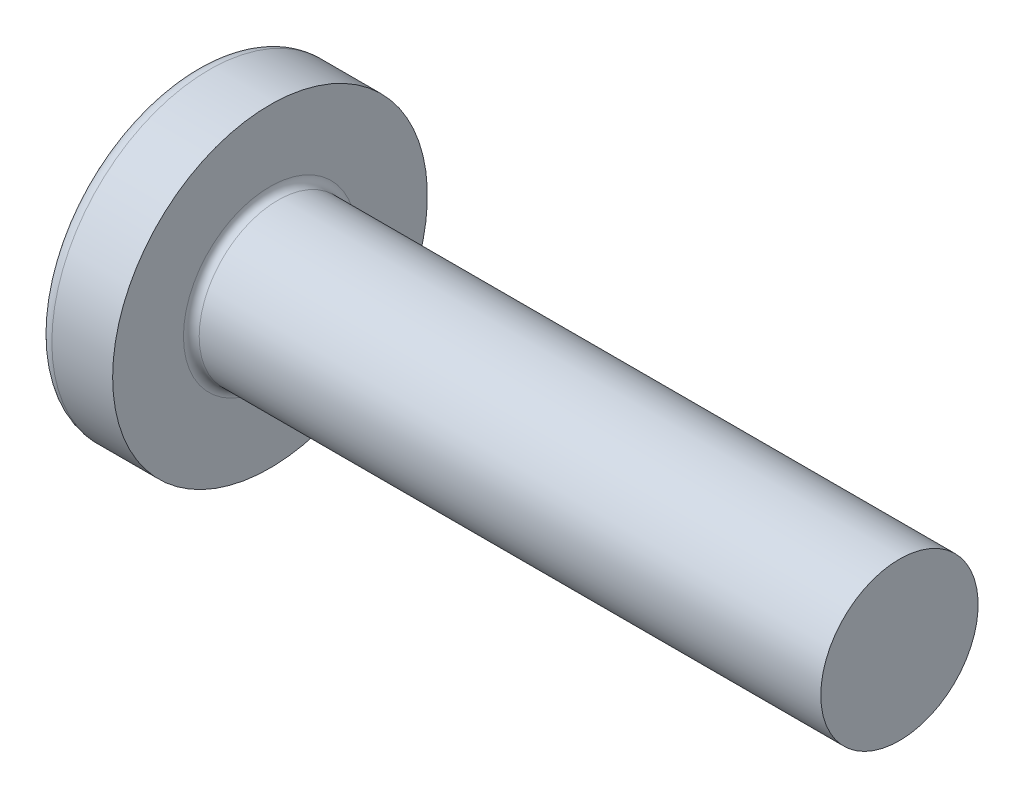
ISO-10303-21;
HEADER;
FILE_DESCRIPTION(('STEP AP214'),'2;1');
FILE_NAME('part.step','',(''),(''),'','','');
FILE_SCHEMA(('AUTOMOTIVE_DESIGN { 1 0 10303 214 1 1 1 1 }'));
ENDSEC;
DATA;
#1=APPLICATION_CONTEXT('core data for automotive mechanical design processes');
#2=APPLICATION_PROTOCOL_DEFINITION('international standard','automotive_design',2000,#1);
#3=PRODUCT_CONTEXT('',#1,'mechanical');
#4=PRODUCT('Part','Part','',(#3));
#5=PRODUCT_RELATED_PRODUCT_CATEGORY('part','',(#4));
#6=PRODUCT_DEFINITION_FORMATION('','',#4);
#7=PRODUCT_DEFINITION_CONTEXT('part definition',#1,'design');
#8=PRODUCT_DEFINITION('design','',#6,#7);
#9=PRODUCT_DEFINITION_SHAPE('','',#8);
#10=(LENGTH_UNIT() NAMED_UNIT(*) SI_UNIT(.MILLI.,.METRE.));
#11=(NAMED_UNIT(*) PLANE_ANGLE_UNIT() SI_UNIT($,.RADIAN.));
#12=(NAMED_UNIT(*) SI_UNIT($,.STERADIAN.) SOLID_ANGLE_UNIT());
#13=UNCERTAINTY_MEASURE_WITH_UNIT(LENGTH_MEASURE(1.E-05),#10,'distance_accuracy_value','');
#14=(GEOMETRIC_REPRESENTATION_CONTEXT(3) GLOBAL_UNCERTAINTY_ASSIGNED_CONTEXT((#13)) GLOBAL_UNIT_ASSIGNED_CONTEXT((#10,
#11,#12)) REPRESENTATION_CONTEXT('',''));
#15=CARTESIAN_POINT('',(0.,0.,0.));
#16=DIRECTION('',(0.,0.,1.));
#17=DIRECTION('',(1.,0.,0.));
#18=AXIS2_PLACEMENT_3D('',#15,#16,#17);
#19=CARTESIAN_POINT('',(6.5,0.,0.));
#20=DIRECTION('',(-1.,0.,0.));
#21=DIRECTION('',(0.,1.,0.));
#22=AXIS2_PLACEMENT_3D('',#19,#20,#21);
#23=SPHERICAL_SURFACE('',#22,6.5);
#24=CARTESIAN_POINT('',(1.26538895452803,0.,0.));
#25=DIRECTION('',(-1.,0.,0.));
#26=DIRECTION('',(0.,0.,1.));
#27=AXIS2_PLACEMENT_3D('',#24,#25,#26);
#28=CIRCLE('',#27,3.85342019543974);
#29=CARTESIAN_POINT('',(1.26538895452803,0.,3.85342019543974));
#30=VERTEX_POINT('',#29);
#31=EDGE_CURVE('E215',#30,#30,#28,.T.);
#32=ORIENTED_EDGE('',*,*,#31,.T.);
#33=EDGE_LOOP('',(#32));
#34=FACE_BOUND('',#33,.T.);
#35=CARTESIAN_POINT('',(0.0788099820016241,0.,0.));
#36=DIRECTION('',(1.,0.,0.));
#37=DIRECTION('',(0.,0.,-1.));
#38=AXIS2_PLACEMENT_3D('',#35,#36,#37);
#39=CIRCLE('',#38,1.0091178091571);
#40=CARTESIAN_POINT('',(0.0788099820016247,-0.514999999999997,-0.867809744562728));
#41=VERTEX_POINT('',#40);
#42=CARTESIAN_POINT('',(0.0788099820016241,-0.867809744562723,-0.515));
#43=VERTEX_POINT('',#42);
#44=EDGE_CURVE('E341',#41,#43,#39,.F.);
#45=ORIENTED_EDGE('',*,*,#44,.F.);
#46=CARTESIAN_POINT('',(6.5,-0.515,0.));
#47=DIRECTION('',(0.,1.,0.));
#48=DIRECTION('',(0.,0.,1.));
#49=AXIS2_PLACEMENT_3D('',#46,#47,#48);
#50=CIRCLE('',#49,6.47956595768575);
#51=CARTESIAN_POINT('',(0.331830520157853,-0.514999999999993,-1.98455543332603));
#52=VERTEX_POINT('',#51);
#53=EDGE_CURVE('E275',#52,#41,#50,.T.);
#54=ORIENTED_EDGE('',*,*,#53,.F.);
#55=CARTESIAN_POINT('',(6.06443225879603,0.,0.873613881878154));
#56=DIRECTION('',(0.446197753347436,0.,-0.894934391398443));
#57=DIRECTION('',(-0.894934391398442,0.,-0.446197753347436));
#58=AXIS2_PLACEMENT_3D('',#55,#56,#57);
#59=CIRCLE('',#58,6.42628038045433);
#60=CARTESIAN_POINT('',(0.331830520157854,0.515000000000007,-1.98455543332603));
#61=VERTEX_POINT('',#60);
#62=EDGE_CURVE('E249',#52,#61,#59,.T.);
#63=ORIENTED_EDGE('',*,*,#62,.T.);
#64=CARTESIAN_POINT('',(6.5,0.515,0.));
#65=DIRECTION('',(0.,-1.,0.));
#66=DIRECTION('',(0.,0.,-1.));
#67=AXIS2_PLACEMENT_3D('',#64,#65,#66);
#68=CIRCLE('',#67,6.47956595768575);
#69=CARTESIAN_POINT('',(0.078809982001625,0.515000000000003,-0.867809744562724));
#70=VERTEX_POINT('',#69);
#71=EDGE_CURVE('E303',#70,#61,#68,.T.);
#72=ORIENTED_EDGE('',*,*,#71,.F.);
#73=CARTESIAN_POINT('',(0.0788099820016241,0.867809744562721,-0.515));
#74=VERTEX_POINT('',#73);
#75=EDGE_CURVE('E356',#74,#70,#39,.F.);
#76=ORIENTED_EDGE('',*,*,#75,.F.);
#77=CARTESIAN_POINT('',(6.5,0.,-0.515));
#78=DIRECTION('',(0.,0.,1.));
#79=DIRECTION('',(0.,-1.,0.));
#80=AXIS2_PLACEMENT_3D('',#77,#78,#79);
#81=CIRCLE('',#80,6.47956595768575);
#82=CARTESIAN_POINT('',(0.331830520157856,1.98455543332603,-0.515));
#83=VERTEX_POINT('',#82);
#84=EDGE_CURVE('E243',#83,#74,#81,.T.);
#85=ORIENTED_EDGE('',*,*,#84,.F.);
#86=CARTESIAN_POINT('',(6.06443225879604,-0.873613881878153,0.));
#87=DIRECTION('',(0.446197753347436,0.894934391398443,0.));
#88=DIRECTION('',(-0.894934391398443,0.446197753347436,0.));
#89=AXIS2_PLACEMENT_3D('',#86,#87,#88);
#90=CIRCLE('',#89,6.42628038045433);
#91=CARTESIAN_POINT('',(0.331830520157855,1.98455543332603,0.515));
#92=VERTEX_POINT('',#91);
#93=EDGE_CURVE('E246',#83,#92,#90,.T.);
#94=ORIENTED_EDGE('',*,*,#93,.T.);
#95=CARTESIAN_POINT('',(6.5,0.,0.515));
#96=DIRECTION('',(0.,0.,-1.));
#97=DIRECTION('',(0.,1.,0.));
#98=AXIS2_PLACEMENT_3D('',#95,#96,#97);
#99=CIRCLE('',#98,6.47956595768575);
#100=CARTESIAN_POINT('',(0.0788099820016245,0.867809744562719,0.515));
#101=VERTEX_POINT('',#100);
#102=EDGE_CURVE('E239',#101,#92,#99,.T.);
#103=ORIENTED_EDGE('',*,*,#102,.F.);
#104=CARTESIAN_POINT('',(0.0788099820016255,0.514999999999997,0.867809744562728));
#105=VERTEX_POINT('',#104);
#106=EDGE_CURVE('E355',#105,#101,#39,.F.);
#107=ORIENTED_EDGE('',*,*,#106,.F.);
#108=CARTESIAN_POINT('',(0.331830520157856,0.514999999999993,1.98455543332603));
#109=VERTEX_POINT('',#108);
#110=EDGE_CURVE('E259',#109,#105,#68,.T.);
#111=ORIENTED_EDGE('',*,*,#110,.F.);
#112=CARTESIAN_POINT('',(6.06443225879604,0.,-0.873613881878152));
#113=DIRECTION('',(0.446197753347436,0.,0.894934391398443));
#114=DIRECTION('',(0.894934391398443,0.,-0.446197753347436));
#115=AXIS2_PLACEMENT_3D('',#112,#113,#114);
#116=CIRCLE('',#115,6.42628038045433);
#117=CARTESIAN_POINT('',(0.331830520157855,-0.515000000000007,1.98455543332603));
#118=VERTEX_POINT('',#117);
#119=EDGE_CURVE('E50',#109,#118,#116,.T.);
#120=ORIENTED_EDGE('',*,*,#119,.T.);
#121=CARTESIAN_POINT('',(0.078809982001625,-0.515000000000003,0.867809744562724));
#122=VERTEX_POINT('',#121);
#123=EDGE_CURVE('E256',#122,#118,#50,.T.);
#124=ORIENTED_EDGE('',*,*,#123,.F.);
#125=CARTESIAN_POINT('',(0.0788099820016245,-0.867809744562721,0.514999999999999));
#126=VERTEX_POINT('',#125);
#127=EDGE_CURVE('E387',#126,#122,#39,.F.);
#128=ORIENTED_EDGE('',*,*,#127,.F.);
#129=CARTESIAN_POINT('',(0.331830520157853,-1.98455543332603,0.515));
#130=VERTEX_POINT('',#129);
#131=EDGE_CURVE('E240',#130,#126,#99,.T.);
#132=ORIENTED_EDGE('',*,*,#131,.F.);
#133=CARTESIAN_POINT('',(6.06443225879603,0.873613881878154,0.));
#134=DIRECTION('',(0.446197753347436,-0.894934391398443,0.));
#135=DIRECTION('',(0.894934391398442,0.446197753347436,0.));
#136=AXIS2_PLACEMENT_3D('',#133,#134,#135);
#137=CIRCLE('',#136,6.42628038045433);
#138=CARTESIAN_POINT('',(0.331830520157854,-1.98455543332603,-0.515));
#139=VERTEX_POINT('',#138);
#140=EDGE_CURVE('E236',#130,#139,#137,.T.);
#141=ORIENTED_EDGE('',*,*,#140,.T.);
#142=EDGE_CURVE('E65',#43,#139,#81,.T.);
#143=ORIENTED_EDGE('',*,*,#142,.F.);
#144=EDGE_LOOP('',(#45,#54,#63,#72,#76,#85,#94,#103,#107,#111,#120,#124,#128,#132,#141,#143));
#145=FACE_BOUND('',#144,.T.);
#146=ADVANCED_FACE('F37',(#34,#145),#23,.T.);
#147=CARTESIAN_POINT('',(0.,2.15,-0.515));
#148=DIRECTION('',(0.,0.,1.));
#149=DIRECTION('',(0.,-1.,0.));
#150=AXIS2_PLACEMENT_3D('',#147,#148,#149);
#151=PLANE('',#150);
#152=ORIENTED_EDGE('',*,*,#84,.T.);
#153=CARTESIAN_POINT('',(-1.51195208675156,0.994972220320188,-0.515));
#154=CARTESIAN_POINT('',(-1.20405981949279,0.970722016949958,-0.515));
#155=CARTESIAN_POINT('',(-0.896180907521174,0.946299109919651,-0.515));
#156=CARTESIAN_POINT('',(-0.280449079832185,0.896981122427852,-0.515));
#157=CARTESIAN_POINT('',(0.0274038344396875,0.872086023934883,-0.515));
#158=CARTESIAN_POINT('',(0.489146739515351,0.83429553519528,-0.515));
#159=CARTESIAN_POINT('',(0.643055047553846,0.821624058404092,-0.515));
#160=CARTESIAN_POINT('',(0.950856520197141,0.796108332639504,-0.515));
#161=CARTESIAN_POINT('',(1.10474968487868,0.783264084592466,-0.515));
#162=CARTESIAN_POINT('',(1.41251352095103,0.757376569093379,-0.515));
#163=CARTESIAN_POINT('',(1.56638419296577,0.744333309065218,-0.515));
#164=CARTESIAN_POINT('',(1.87410847343336,0.718013273188896,-0.515));
#165=CARTESIAN_POINT('',(2.02796208151372,0.704736492982792,-0.515));
#166=CARTESIAN_POINT('',(2.36455311890989,0.675386943006726,-0.515));
#167=CARTESIAN_POINT('',(2.54728562293342,0.659257575640986,-0.515));
#168=CARTESIAN_POINT('',(2.91270624109256,0.626517182479888,-0.515));
#169=CARTESIAN_POINT('',(3.09539435554038,0.609906160177238,-0.515));
#170=CARTESIAN_POINT('',(3.46069832191613,0.576073027116421,-0.515));
#171=CARTESIAN_POINT('',(3.64331417870068,0.558850968932727,-0.515));
#172=CARTESIAN_POINT('',(4.00847437496567,0.523604864540037,-0.515));
#173=CARTESIAN_POINT('',(4.19101871216888,0.505580794604253,-0.515));
#174=CARTESIAN_POINT('',(4.55606208157937,0.468429191666488,-0.515));
#175=CARTESIAN_POINT('',(4.73856107358023,0.449301262281854,-0.515));
#176=CARTESIAN_POINT('',(5.10337547353419,0.409473604748924,-0.515));
#177=CARTESIAN_POINT('',(5.28569089526422,0.388774005106069,-0.515));
#178=CARTESIAN_POINT('',(5.55897278495412,0.355828287527264,-0.515));
#179=CARTESIAN_POINT('',(5.65005277419686,0.344527918782738,-0.515));
#180=CARTESIAN_POINT('',(5.83209904103608,0.321075174263031,-0.515));
#181=CARTESIAN_POINT('',(5.92306532397915,0.308922840209686,-0.515));
#182=CARTESIAN_POINT('',(6.10486078872898,0.28342733445193,-0.515));
#183=CARTESIAN_POINT('',(6.19568992299379,0.270083817601715,-0.515));
#184=CARTESIAN_POINT('',(6.33172773785679,0.248701420809951,-0.515));
#185=CARTESIAN_POINT('',(6.37704304473344,0.241345446705304,-0.515));
#186=CARTESIAN_POINT('',(6.4675722520141,0.226018953559338,-0.515));
#187=CARTESIAN_POINT('',(6.51278614568083,0.218048394864476,-0.515));
#188=CARTESIAN_POINT('',(6.55793125759549,0.209691465274945,-0.515));
#189=B_SPLINE_CURVE_WITH_KNOTS('',3,(#153,#154,#155,#156,#157,#158,#159,#160,#161,#162,#163,
#164,#165,#166,#167,#168,#169,#170,#171,#172,#173,#174,#175,#176,#177,#178,#179,#180,#181,#182,
#183,#184,#185,#186,#187,#188),.UNSPECIFIED.,.F.,.F.,(4,2,2,2,2,2,2,2,2,2,2,2,2,2,2,2,2,4),(0.,
0.926537709781721,1.85311087258339,2.31639796016285,2.77968256468771,3.24294992902055,
3.70622594801777,4.25655436065378,4.80687878359543,5.35715597005738,5.90744944680718,
6.45794177197673,7.008389135274,7.28372117336899,7.55903973750591,7.83443833587748,
7.97216007460854,8.10989070671571),.UNSPECIFIED.);
#190=CARTESIAN_POINT('',(2.34,0.677477674908923,-0.515));
#191=VERTEX_POINT('',#190);
#192=EDGE_CURVE('E376',#74,#191,#189,.T.);
#193=ORIENTED_EDGE('',*,*,#192,.T.);
#194=DIRECTION('',(0.,1.,0.));
#195=VECTOR('',#194,1.);
#196=CARTESIAN_POINT('',(2.34,-0.983319232260742,-0.515));
#197=LINE('',#196,#195);
#198=CARTESIAN_POINT('',(2.34,0.983319232260742,-0.515));
#199=VERTEX_POINT('',#198);
#200=EDGE_CURVE('E324',#191,#199,#197,.T.);
#201=ORIENTED_EDGE('',*,*,#200,.T.);
#202=DIRECTION('',(0.894934391398442,-0.446197753347436,0.));
#203=VECTOR('',#202,1.);
#204=CARTESIAN_POINT('',(0.,2.15,-0.515));
#205=LINE('',#204,#203);
#206=EDGE_CURVE('E216',#83,#199,#205,.T.);
#207=ORIENTED_EDGE('',*,*,#206,.F.);
#208=EDGE_LOOP('',(#152,#193,#201,#207));
#209=FACE_BOUND('',#208,.T.);
#210=ADVANCED_FACE('F171',(#209),#151,.T.);
#211=CARTESIAN_POINT('',(2.34,-0.983319232260742,-0.515));
#212=VERTEX_POINT('',#211);
#213=CARTESIAN_POINT('',(2.34,-0.677477674908923,-0.515));
#214=VERTEX_POINT('',#213);
#215=EDGE_CURVE('E224',#212,#214,#197,.T.);
#216=ORIENTED_EDGE('',*,*,#215,.T.);
#217=CARTESIAN_POINT('',(-1.51195208754037,-0.994972220382298,-0.515));
#218=CARTESIAN_POINT('',(-1.20405982018868,-0.970722017005064,-0.515));
#219=CARTESIAN_POINT('',(-0.896180908124144,-0.946299109967689,-0.515));
#220=CARTESIAN_POINT('',(-0.280449080249312,-0.896981122461527,-0.515));
#221=CARTESIAN_POINT('',(0.0274038341154851,-0.872086023961265,-0.515));
#222=CARTESIAN_POINT('',(0.489146739371409,-0.834295535207136,-0.515));
#223=CARTESIAN_POINT('',(0.643055047497245,-0.821624058408796,-0.515));
#224=CARTESIAN_POINT('',(0.950856520315203,-0.796108332629706,-0.515));
#225=CARTESIAN_POINT('',(1.10474968508407,-0.783264084575318,-0.515));
#226=CARTESIAN_POINT('',(1.41251352133103,-0.757376569061287,-0.515));
#227=CARTESIAN_POINT('',(1.56638419343305,-0.744333309025534,-0.515));
#228=CARTESIAN_POINT('',(1.87410847407519,-0.718013273133716,-0.515));
#229=CARTESIAN_POINT('',(2.02796208224283,-0.70473649291971,-0.515));
#230=CARTESIAN_POINT('',(2.36455311972626,-0.675386942934956,-0.515));
#231=CARTESIAN_POINT('',(2.5472856237498,-0.659257575568568,-0.515));
#232=CARTESIAN_POINT('',(2.91270624190895,-0.626517182406014,-0.515));
#233=CARTESIAN_POINT('',(3.09539435635676,-0.609906160102554,-0.515));
#234=CARTESIAN_POINT('',(3.46069832273244,-0.576073027039889,-0.515));
#235=CARTESIAN_POINT('',(3.64331417951694,-0.558850968855156,-0.515));
#236=CARTESIAN_POINT('',(4.00847437578178,-0.523604864460044,-0.515));
#237=CARTESIAN_POINT('',(4.19101871298491,-0.505580794522876,-0.515));
#238=CARTESIAN_POINT('',(4.55606208239526,-0.468429191581779,-0.515));
#239=CARTESIAN_POINT('',(4.73856107439607,-0.449301262195198,-0.515));
#240=CARTESIAN_POINT('',(5.10337547434978,-0.409473604657435,-0.515));
#241=CARTESIAN_POINT('',(5.28569089607961,-0.388774005011695,-0.515));
#242=CARTESIAN_POINT('',(5.55897278576906,-0.355828287427082,-0.515));
#243=CARTESIAN_POINT('',(5.65005277501166,-0.344527918680369,-0.515));
#244=CARTESIAN_POINT('',(5.83209904185046,-0.3210751741555,-0.515));
#245=CARTESIAN_POINT('',(5.92306532479326,-0.308922840099181,-0.515));
#246=CARTESIAN_POINT('',(6.10486078954238,-0.283427334334153,-0.515));
#247=CARTESIAN_POINT('',(6.19568992380676,-0.270083817479637,-0.515));
#248=CARTESIAN_POINT('',(6.33172773866874,-0.248701420679479,-0.515));
#249=CARTESIAN_POINT('',(6.377043045545,-0.241345446571707,-0.515));
#250=CARTESIAN_POINT('',(6.46757225282465,-0.226018953418424,-0.515));
#251=CARTESIAN_POINT('',(6.51278614649077,-0.218048394719369,-0.515));
#252=CARTESIAN_POINT('',(6.55793125840465,-0.209691465124902,-0.515));
#253=B_SPLINE_CURVE_WITH_KNOTS('',3,(#217,#218,#219,#220,#221,#222,#223,#224,#225,#226,#227,
#228,#229,#230,#231,#232,#233,#234,#235,#236,#237,#238,#239,#240,#241,#242,#243,#244,#245,#246,
#247,#248,#249,#250,#251,#252),.UNSPECIFIED.,.F.,.F.,(4,2,2,2,2,2,2,2,2,2,2,2,2,2,2,2,2,4),(0.,
0.926537710061278,1.85311087314258,2.31639796098494,2.77968256577269,3.24294993036838,
3.70622594962848,4.2565543622647,4.80687878520654,5.35715597166861,5.90744944841855,
6.45794177358856,7.00838913688619,7.28372117498157,7.55903973911884,7.83443833749096,
7.97216007622236,8.10989070832989),.UNSPECIFIED.);
#254=EDGE_CURVE('E354',#214,#43,#253,.F.);
#255=ORIENTED_EDGE('',*,*,#254,.T.);
#256=ORIENTED_EDGE('',*,*,#142,.T.);
#257=DIRECTION('',(0.894934391398442,0.446197753347436,0.));
#258=VECTOR('',#257,1.);
#259=CARTESIAN_POINT('',(0.,-2.15,-0.515));
#260=LINE('',#259,#258);
#261=EDGE_CURVE('E306',#139,#212,#260,.T.);
#262=ORIENTED_EDGE('',*,*,#261,.T.);
#263=EDGE_LOOP('',(#216,#255,#256,#262));
#264=FACE_BOUND('',#263,.T.);
#265=ADVANCED_FACE('F177',(#264),#151,.T.);
#266=CARTESIAN_POINT('',(0.,-2.15,0.514999999999999));
#267=DIRECTION('',(0.,0.,-1.));
#268=DIRECTION('',(0.,1.,0.));
#269=AXIS2_PLACEMENT_3D('',#266,#267,#268);
#270=PLANE('',#269);
#271=DIRECTION('',(0.,-1.,0.));
#272=VECTOR('',#271,1.);
#273=CARTESIAN_POINT('',(2.34,0.983319232260743,0.515));
#274=LINE('',#273,#272);
#275=CARTESIAN_POINT('',(2.34,0.983319232260743,0.515));
#276=VERTEX_POINT('',#275);
#277=CARTESIAN_POINT('',(2.34,0.677477674908923,0.515));
#278=VERTEX_POINT('',#277);
#279=EDGE_CURVE('E314',#276,#278,#274,.T.);
#280=ORIENTED_EDGE('',*,*,#279,.T.);
#281=CARTESIAN_POINT('',(-1.51195208754037,0.994972220382298,0.515));
#282=CARTESIAN_POINT('',(-1.20405982018868,0.970722017005064,0.515));
#283=CARTESIAN_POINT('',(-0.896180908124144,0.946299109967689,0.515));
#284=CARTESIAN_POINT('',(-0.280449080249312,0.896981122461528,0.515));
#285=CARTESIAN_POINT('',(0.0274038341154853,0.872086023961265,0.515));
#286=CARTESIAN_POINT('',(0.489146739371408,0.834295535207137,0.515));
#287=CARTESIAN_POINT('',(0.643055047497245,0.821624058408796,0.515));
#288=CARTESIAN_POINT('',(0.950856520315203,0.796108332629706,0.515));
#289=CARTESIAN_POINT('',(1.10474968508407,0.783264084575318,0.515));
#290=CARTESIAN_POINT('',(1.41251352133103,0.757376569061287,0.515));
#291=CARTESIAN_POINT('',(1.56638419343305,0.744333309025534,0.515));
#292=CARTESIAN_POINT('',(1.87410847407519,0.718013273133716,0.515));
#293=CARTESIAN_POINT('',(2.02796208224283,0.70473649291971,0.515));
#294=CARTESIAN_POINT('',(2.36455311972626,0.675386942934956,0.515));
#295=CARTESIAN_POINT('',(2.5472856237498,0.659257575568568,0.515));
#296=CARTESIAN_POINT('',(2.91270624190895,0.626517182406013,0.515));
#297=CARTESIAN_POINT('',(3.09539435635676,0.609906160102554,0.515));
#298=CARTESIAN_POINT('',(3.46069832273244,0.576073027039889,0.515));
#299=CARTESIAN_POINT('',(3.64331417951694,0.558850968855156,0.515));
#300=CARTESIAN_POINT('',(4.00847437578178,0.523604864460044,0.515));
#301=CARTESIAN_POINT('',(4.19101871298491,0.505580794522875,0.515));
#302=CARTESIAN_POINT('',(4.55606208239526,0.468429191581779,0.515));
#303=CARTESIAN_POINT('',(4.73856107439607,0.449301262195197,0.515));
#304=CARTESIAN_POINT('',(5.10337547434978,0.409473604657434,0.515));
#305=CARTESIAN_POINT('',(5.28569089607961,0.388774005011694,0.515));
#306=CARTESIAN_POINT('',(5.55897278576906,0.355828287427081,0.515));
#307=CARTESIAN_POINT('',(5.65005277501166,0.344527918680368,0.515));
#308=CARTESIAN_POINT('',(5.83209904185046,0.321075174155499,0.515));
#309=CARTESIAN_POINT('',(5.92306532479326,0.30892284009918,0.515));
#310=CARTESIAN_POINT('',(6.10486078954238,0.283427334334152,0.515));
#311=CARTESIAN_POINT('',(6.19568992380676,0.270083817479636,0.515));
#312=CARTESIAN_POINT('',(6.33172773866874,0.248701420679478,0.515));
#313=CARTESIAN_POINT('',(6.377043045545,0.241345446571706,0.515));
#314=CARTESIAN_POINT('',(6.46757225282466,0.226018953418422,0.515));
#315=CARTESIAN_POINT('',(6.51278614649077,0.218048394719367,0.515));
#316=CARTESIAN_POINT('',(6.55793125840465,0.2096914651249,0.515));
#317=B_SPLINE_CURVE_WITH_KNOTS('',3,(#281,#282,#283,#284,#285,#286,#287,#288,#289,#290,#291,
#292,#293,#294,#295,#296,#297,#298,#299,#300,#301,#302,#303,#304,#305,#306,#307,#308,#309,#310,
#311,#312,#313,#314,#315,#316),.UNSPECIFIED.,.F.,.F.,(4,2,2,2,2,2,2,2,2,2,2,2,2,2,2,2,2,4),(0.,
0.926537710061278,1.85311087314258,2.31639796098494,2.77968256577269,3.24294993036838,
3.70622594962848,4.2565543622647,4.80687878520654,5.3571559716686,5.90744944841855,
6.45794177358856,7.00838913688619,7.28372117498157,7.55903973911884,7.83443833749096,
7.97216007622236,8.10989070832989),.UNSPECIFIED.);
#318=EDGE_CURVE('E280',#278,#101,#317,.F.);
#319=ORIENTED_EDGE('',*,*,#318,.T.);
#320=ORIENTED_EDGE('',*,*,#102,.T.);
#321=DIRECTION('',(0.894934391398443,-0.446197753347436,0.));
#322=VECTOR('',#321,1.);
#323=CARTESIAN_POINT('',(0.,2.15,0.515));
#324=LINE('',#323,#322);
#325=EDGE_CURVE('E221',#92,#276,#324,.T.);
#326=ORIENTED_EDGE('',*,*,#325,.T.);
#327=EDGE_LOOP('',(#280,#319,#320,#326));
#328=FACE_BOUND('',#327,.T.);
#329=ADVANCED_FACE('F372',(#328),#270,.T.);
#330=ORIENTED_EDGE('',*,*,#131,.T.);
#331=CARTESIAN_POINT('',(-1.51195208754037,-0.994972220382298,0.514999999999999));
#332=CARTESIAN_POINT('',(-1.20405982018868,-0.970722017005064,0.514999999999999));
#333=CARTESIAN_POINT('',(-0.896180908124144,-0.946299109967689,0.514999999999999));
#334=CARTESIAN_POINT('',(-0.280449080249312,-0.896981122461528,0.515));
#335=CARTESIAN_POINT('',(0.0274038341154852,-0.872086023961265,0.515));
#336=CARTESIAN_POINT('',(0.489146739371408,-0.834295535207137,0.515));
#337=CARTESIAN_POINT('',(0.643055047497245,-0.821624058408796,0.515));
#338=CARTESIAN_POINT('',(0.950856520315204,-0.796108332629706,0.515));
#339=CARTESIAN_POINT('',(1.10474968508407,-0.783264084575318,0.515));
#340=CARTESIAN_POINT('',(1.41251352133103,-0.757376569061288,0.515));
#341=CARTESIAN_POINT('',(1.56638419343305,-0.744333309025534,0.515));
#342=CARTESIAN_POINT('',(1.87410847407519,-0.718013273133716,0.515));
#343=CARTESIAN_POINT('',(2.02796208224283,-0.70473649291971,0.515));
#344=CARTESIAN_POINT('',(2.36455311972626,-0.675386942934956,0.515));
#345=CARTESIAN_POINT('',(2.5472856237498,-0.659257575568568,0.515));
#346=CARTESIAN_POINT('',(2.91270624190895,-0.626517182406014,0.515));
#347=CARTESIAN_POINT('',(3.09539435635676,-0.609906160102554,0.515));
#348=CARTESIAN_POINT('',(3.46069832273244,-0.576073027039889,0.515));
#349=CARTESIAN_POINT('',(3.64331417951694,-0.558850968855156,0.515));
#350=CARTESIAN_POINT('',(4.00847437578178,-0.523604864460044,0.515));
#351=CARTESIAN_POINT('',(4.1910187129849,-0.505580794522876,0.515));
#352=CARTESIAN_POINT('',(4.55606208239526,-0.468429191581779,0.515));
#353=CARTESIAN_POINT('',(4.73856107439606,-0.449301262195197,0.515));
#354=CARTESIAN_POINT('',(5.10337547434978,-0.409473604657434,0.515));
#355=CARTESIAN_POINT('',(5.28569089607961,-0.388774005011694,0.515));
#356=CARTESIAN_POINT('',(5.55897278576906,-0.355828287427082,0.515));
#357=CARTESIAN_POINT('',(5.65005277501166,-0.344527918680368,0.515));
#358=CARTESIAN_POINT('',(5.83209904185046,-0.321075174155499,0.515));
#359=CARTESIAN_POINT('',(5.92306532479326,-0.30892284009918,0.515));
#360=CARTESIAN_POINT('',(6.10486078954238,-0.283427334334152,0.515));
#361=CARTESIAN_POINT('',(6.19568992380676,-0.270083817479637,0.515));
#362=CARTESIAN_POINT('',(6.33172773866873,-0.248701420679478,0.515));
#363=CARTESIAN_POINT('',(6.37704304554499,-0.241345446571707,0.515));
#364=CARTESIAN_POINT('',(6.46757225282465,-0.226018953418423,0.515));
#365=CARTESIAN_POINT('',(6.51278614649077,-0.218048394719368,0.515));
#366=CARTESIAN_POINT('',(6.55793125840465,-0.209691465124901,0.515));
#367=B_SPLINE_CURVE_WITH_KNOTS('',3,(#331,#332,#333,#334,#335,#336,#337,#338,#339,#340,#341,
#342,#343,#344,#345,#346,#347,#348,#349,#350,#351,#352,#353,#354,#355,#356,#357,#358,#359,#360,
#361,#362,#363,#364,#365,#366),.UNSPECIFIED.,.F.,.F.,(4,2,2,2,2,2,2,2,2,2,2,2,2,2,2,2,2,4),(0.,
0.926537710061279,1.85311087314258,2.31639796098494,2.77968256577269,3.24294993036838,
3.70622594962848,4.2565543622647,4.80687878520654,5.3571559716686,5.90744944841855,
6.45794177358856,7.00838913688619,7.28372117498157,7.55903973911884,7.83443833749096,
7.97216007622236,8.10989070832989),.UNSPECIFIED.);
#368=CARTESIAN_POINT('',(2.34,-0.677477674908923,0.515));
#369=VERTEX_POINT('',#368);
#370=EDGE_CURVE('E388',#126,#369,#367,.T.);
#371=ORIENTED_EDGE('',*,*,#370,.T.);
#372=CARTESIAN_POINT('',(2.34,-0.983319232260743,0.515));
#373=VERTEX_POINT('',#372);
#374=EDGE_CURVE('E316',#369,#373,#274,.T.);
#375=ORIENTED_EDGE('',*,*,#374,.T.);
#376=DIRECTION('',(0.894934391398443,0.446197753347436,0.));
#377=VECTOR('',#376,1.);
#378=CARTESIAN_POINT('',(0.,-2.15,0.514999999999999));
#379=LINE('',#378,#377);
#380=EDGE_CURVE('E308',#130,#373,#379,.T.);
#381=ORIENTED_EDGE('',*,*,#380,.F.);
#382=EDGE_LOOP('',(#330,#371,#375,#381));
#383=FACE_BOUND('',#382,.T.);
#384=ADVANCED_FACE('F417',(#383),#270,.T.);
#385=CARTESIAN_POINT('',(2.34,0.983319232260742,-0.515));
#386=DIRECTION('',(-1.,0.,0.));
#387=DIRECTION('',(0.,0.,1.));
#388=AXIS2_PLACEMENT_3D('',#385,#386,#387);
#389=PLANE('',#388);
#390=ORIENTED_EDGE('',*,*,#374,.F.);
#391=CARTESIAN_POINT('',(2.34,0.,0.));
#392=DIRECTION('',(-1.,0.,0.));
#393=DIRECTION('',(0.,0.,1.));
#394=AXIS2_PLACEMENT_3D('',#391,#392,#393);
#395=CIRCLE('',#394,0.851);
#396=EDGE_CURVE('E349',#214,#369,#395,.T.);
#397=ORIENTED_EDGE('',*,*,#396,.F.);
#398=ORIENTED_EDGE('',*,*,#215,.F.);
#399=DIRECTION('',(0.,0.,1.));
#400=VECTOR('',#399,1.);
#401=CARTESIAN_POINT('',(2.34,-0.983319232260742,-0.515));
#402=LINE('',#401,#400);
#403=EDGE_CURVE('E311',#212,#373,#402,.T.);
#404=ORIENTED_EDGE('',*,*,#403,.T.);
#405=EDGE_LOOP('',(#390,#397,#398,#404));
#406=FACE_BOUND('',#405,.T.);
#407=ADVANCED_FACE('F410',(#406),#389,.T.);
#408=DIRECTION('',(0.,0.,-1.));
#409=VECTOR('',#408,1.);
#410=CARTESIAN_POINT('',(2.34,-0.515000000000003,0.983319232260741));
#411=LINE('',#410,#409);
#412=CARTESIAN_POINT('',(2.34,-0.514999999999998,-0.677477674908924));
#413=VERTEX_POINT('',#412);
#414=CARTESIAN_POINT('',(2.34,-0.514999999999996,-0.983319232260744));
#415=VERTEX_POINT('',#414);
#416=EDGE_CURVE('E297',#413,#415,#411,.T.);
#417=ORIENTED_EDGE('',*,*,#416,.F.);
#418=CARTESIAN_POINT('',(2.34,0.515000000000002,-0.677477674908921));
#419=VERTEX_POINT('',#418);
#420=EDGE_CURVE('E57',#419,#413,#395,.T.);
#421=ORIENTED_EDGE('',*,*,#420,.F.);
#422=DIRECTION('',(0.,0.,1.));
#423=VECTOR('',#422,1.);
#424=CARTESIAN_POINT('',(2.34,0.515000000000004,-0.98331923226074));
#425=LINE('',#424,#423);
#426=CARTESIAN_POINT('',(2.34,0.515000000000004,-0.98331923226074));
#427=VERTEX_POINT('',#426);
#428=EDGE_CURVE('E300',#427,#419,#425,.T.);
#429=ORIENTED_EDGE('',*,*,#428,.F.);
#430=DIRECTION('',(0.,-1.,0.));
#431=VECTOR('',#430,1.);
#432=CARTESIAN_POINT('',(2.34,0.515000000000004,-0.98331923226074));
#433=LINE('',#432,#431);
#434=EDGE_CURVE('E291',#427,#415,#433,.T.);
#435=ORIENTED_EDGE('',*,*,#434,.T.);
#436=EDGE_LOOP('',(#417,#421,#429,#435));
#437=FACE_BOUND('',#436,.T.);
#438=ADVANCED_FACE('F344',(#437),#389,.T.);
#439=ORIENTED_EDGE('',*,*,#200,.F.);
#440=EDGE_CURVE('E348',#278,#191,#395,.T.);
#441=ORIENTED_EDGE('',*,*,#440,.F.);
#442=ORIENTED_EDGE('',*,*,#279,.F.);
#443=DIRECTION('',(0.,0.,-1.));
#444=VECTOR('',#443,1.);
#445=CARTESIAN_POINT('',(2.34,0.983319232260743,0.515));
#446=LINE('',#445,#444);
#447=EDGE_CURVE('E317',#276,#199,#446,.T.);
#448=ORIENTED_EDGE('',*,*,#447,.T.);
#449=EDGE_LOOP('',(#439,#441,#442,#448));
#450=FACE_BOUND('',#449,.T.);
#451=ADVANCED_FACE('F411',(#450),#389,.T.);
#452=CARTESIAN_POINT('',(0.,0.514999999999992,2.15));
#453=DIRECTION('',(0.,-1.,0.));
#454=DIRECTION('',(0.,0.,-1.));
#455=AXIS2_PLACEMENT_3D('',#452,#453,#454);
#456=PLANE('',#455);
#457=ORIENTED_EDGE('',*,*,#110,.T.);
#458=CARTESIAN_POINT('',(-1.51195208675156,0.514999999999997,0.99497222032019));
#459=CARTESIAN_POINT('',(-1.20405981949279,0.514999999999997,0.97072201694996));
#460=CARTESIAN_POINT('',(-0.896180907521174,0.514999999999997,0.946299109919653));
#461=CARTESIAN_POINT('',(-0.280449079832185,0.514999999999997,0.896981122427853));
#462=CARTESIAN_POINT('',(0.0274038344396876,0.514999999999997,0.872086023934885));
#463=CARTESIAN_POINT('',(0.489146739515351,0.514999999999997,0.834295535195282));
#464=CARTESIAN_POINT('',(0.643055047553846,0.514999999999997,0.821624058404094));
#465=CARTESIAN_POINT('',(0.950856520197141,0.514999999999997,0.796108332639506));
#466=CARTESIAN_POINT('',(1.10474968487868,0.514999999999997,0.783264084592467));
#467=CARTESIAN_POINT('',(1.41251352095103,0.514999999999997,0.75737656909338));
#468=CARTESIAN_POINT('',(1.56638419296577,0.514999999999997,0.74433330906522));
#469=CARTESIAN_POINT('',(1.87410847343335,0.514999999999997,0.718013273188898));
#470=CARTESIAN_POINT('',(2.02796208151372,0.514999999999997,0.704736492982794));
#471=CARTESIAN_POINT('',(2.36455311890989,0.514999999999998,0.675386943006728));
#472=CARTESIAN_POINT('',(2.54728562293342,0.514999999999998,0.659257575640988));
#473=CARTESIAN_POINT('',(2.91270624109256,0.514999999999998,0.62651718247989));
#474=CARTESIAN_POINT('',(3.09539435554038,0.514999999999998,0.60990616017724));
#475=CARTESIAN_POINT('',(3.46069832191612,0.514999999999998,0.576073027116423));
#476=CARTESIAN_POINT('',(3.64331417870068,0.514999999999998,0.558850968932729));
#477=CARTESIAN_POINT('',(4.00847437496567,0.514999999999998,0.523604864540039));
#478=CARTESIAN_POINT('',(4.19101871216888,0.514999999999998,0.505580794604255));
#479=CARTESIAN_POINT('',(4.55606208157937,0.514999999999998,0.46842919166649));
#480=CARTESIAN_POINT('',(4.73856107358022,0.514999999999998,0.449301262281855));
#481=CARTESIAN_POINT('',(5.10337547353418,0.514999999999999,0.409473604748926));
#482=CARTESIAN_POINT('',(5.28569089526422,0.514999999999999,0.388774005106071));
#483=CARTESIAN_POINT('',(5.55897278495412,0.514999999999999,0.355828287527266));
#484=CARTESIAN_POINT('',(5.65005277419686,0.514999999999999,0.34452791878274));
#485=CARTESIAN_POINT('',(5.83209904103608,0.514999999999999,0.321075174263033));
#486=CARTESIAN_POINT('',(5.92306532397915,0.514999999999999,0.308922840209688));
#487=CARTESIAN_POINT('',(6.10486078872898,0.514999999999999,0.283427334451932));
#488=CARTESIAN_POINT('',(6.1956899229938,0.514999999999999,0.270083817601716));
#489=CARTESIAN_POINT('',(6.33172773785679,0.514999999999999,0.248701420809952));
#490=CARTESIAN_POINT('',(6.37704304473344,0.514999999999999,0.241345446705305));
#491=CARTESIAN_POINT('',(6.4675722520141,0.514999999999999,0.226018953559339));
#492=CARTESIAN_POINT('',(6.51278614568083,0.514999999999999,0.218048394864478));
#493=CARTESIAN_POINT('',(6.55793125759549,0.514999999999999,0.209691465274946));
#494=B_SPLINE_CURVE_WITH_KNOTS('',3,(#458,#459,#460,#461,#462,#463,#464,#465,#466,#467,#468,
#469,#470,#471,#472,#473,#474,#475,#476,#477,#478,#479,#480,#481,#482,#483,#484,#485,#486,#487,
#488,#489,#490,#491,#492,#493),.UNSPECIFIED.,.F.,.F.,(4,2,2,2,2,2,2,2,2,2,2,2,2,2,2,2,2,4),(0.,
0.926537709781721,1.85311087258339,2.31639796016285,2.77968256468771,3.24294992902055,
3.70622594801777,4.25655436065378,4.80687878359543,5.35715597005738,5.90744944680718,
6.45794177197673,7.008389135274,7.28372117336899,7.55903973750591,7.83443833587749,
7.97216007460855,8.10989070671571),.UNSPECIFIED.);
#495=CARTESIAN_POINT('',(2.34,0.514999999999998,0.677477674908925));
#496=VERTEX_POINT('',#495);
#497=EDGE_CURVE('E435',#105,#496,#494,.T.);
#498=ORIENTED_EDGE('',*,*,#497,.T.);
#499=CARTESIAN_POINT('',(2.34,0.514999999999996,0.983319232260744));
#500=VERTEX_POINT('',#499);
#501=EDGE_CURVE('E273',#496,#500,#425,.T.);
#502=ORIENTED_EDGE('',*,*,#501,.T.);
#503=DIRECTION('',(0.894934391398442,0.,-0.446197753347436));
#504=VECTOR('',#503,1.);
#505=CARTESIAN_POINT('',(0.,0.514999999999992,2.15));
#506=LINE('',#505,#504);
#507=EDGE_CURVE('E266',#109,#500,#506,.T.);
#508=ORIENTED_EDGE('',*,*,#507,.F.);
#509=EDGE_LOOP('',(#457,#498,#502,#508));
#510=FACE_BOUND('',#509,.T.);
#511=ADVANCED_FACE('F270',(#510),#456,.T.);
#512=CARTESIAN_POINT('',(0.,-0.514999999999992,-2.15));
#513=DIRECTION('',(0.,1.,0.));
#514=DIRECTION('',(0.,0.,1.));
#515=AXIS2_PLACEMENT_3D('',#512,#513,#514);
#516=PLANE('',#515);
#517=CARTESIAN_POINT('',(2.34,-0.515000000000003,0.983319232260741));
#518=VERTEX_POINT('',#517);
#519=CARTESIAN_POINT('',(2.34,-0.515000000000003,0.677477674908921));
#520=VERTEX_POINT('',#519);
#521=EDGE_CURVE('E294',#518,#520,#411,.T.);
#522=ORIENTED_EDGE('',*,*,#521,.T.);
#523=CARTESIAN_POINT('',(-1.51195208675156,-0.515000000000003,0.994972220320186));
#524=CARTESIAN_POINT('',(-1.20405981949279,-0.515000000000003,0.970722016949957));
#525=CARTESIAN_POINT('',(-0.896180907521174,-0.515000000000003,0.94629910991965));
#526=CARTESIAN_POINT('',(-0.280449079832186,-0.515000000000003,0.89698112242785));
#527=CARTESIAN_POINT('',(0.0274038344396872,-0.515000000000003,0.872086023934881));
#528=CARTESIAN_POINT('',(0.489146739515351,-0.515000000000003,0.834295535195279));
#529=CARTESIAN_POINT('',(0.643055047553846,-0.515000000000003,0.821624058404091));
#530=CARTESIAN_POINT('',(0.950856520197141,-0.515000000000003,0.796108332639503));
#531=CARTESIAN_POINT('',(1.10474968487868,-0.515000000000003,0.783264084592464));
#532=CARTESIAN_POINT('',(1.41251352095103,-0.515000000000003,0.757376569093377));
#533=CARTESIAN_POINT('',(1.56638419296577,-0.515000000000003,0.744333309065216));
#534=CARTESIAN_POINT('',(1.87410847343335,-0.515000000000003,0.718013273188894));
#535=CARTESIAN_POINT('',(2.02796208151372,-0.515000000000002,0.70473649298279));
#536=CARTESIAN_POINT('',(2.36455311890989,-0.515000000000002,0.675386943006725));
#537=CARTESIAN_POINT('',(2.54728562293342,-0.515000000000002,0.659257575640984));
#538=CARTESIAN_POINT('',(2.91270624109256,-0.515000000000002,0.626517182479886));
#539=CARTESIAN_POINT('',(3.09539435554038,-0.515000000000002,0.609906160177236));
#540=CARTESIAN_POINT('',(3.46069832191613,-0.515000000000002,0.57607302711642));
#541=CARTESIAN_POINT('',(3.64331417870068,-0.515000000000002,0.558850968932725));
#542=CARTESIAN_POINT('',(4.00847437496567,-0.515000000000002,0.523604864540035));
#543=CARTESIAN_POINT('',(4.19101871216888,-0.515000000000002,0.505580794604251));
#544=CARTESIAN_POINT('',(4.55606208157937,-0.515000000000002,0.468429191666486));
#545=CARTESIAN_POINT('',(4.73856107358022,-0.515000000000002,0.449301262281852));
#546=CARTESIAN_POINT('',(5.10337547353418,-0.515000000000002,0.409473604748922));
#547=CARTESIAN_POINT('',(5.28569089526422,-0.515000000000002,0.388774005106067));
#548=CARTESIAN_POINT('',(5.55897278495412,-0.515000000000002,0.355828287527262));
#549=CARTESIAN_POINT('',(5.65005277419686,-0.515000000000002,0.344527918782736));
#550=CARTESIAN_POINT('',(5.83209904103607,-0.515000000000002,0.321075174263029));
#551=CARTESIAN_POINT('',(5.92306532397915,-0.515000000000001,0.308922840209683));
#552=CARTESIAN_POINT('',(6.10486078872898,-0.515000000000001,0.283427334451927));
#553=CARTESIAN_POINT('',(6.1956899229938,-0.515000000000001,0.270083817601711));
#554=CARTESIAN_POINT('',(6.33172773785679,-0.515000000000001,0.248701420809948));
#555=CARTESIAN_POINT('',(6.37704304473344,-0.515000000000001,0.241345446705301));
#556=CARTESIAN_POINT('',(6.4675722520141,-0.515000000000001,0.226018953559334));
#557=CARTESIAN_POINT('',(6.51278614568083,-0.515000000000001,0.218048394864473));
#558=CARTESIAN_POINT('',(6.55793125759549,-0.515000000000001,0.209691465274941));
#559=B_SPLINE_CURVE_WITH_KNOTS('',3,(#523,#524,#525,#526,#527,#528,#529,#530,#531,#532,#533,
#534,#535,#536,#537,#538,#539,#540,#541,#542,#543,#544,#545,#546,#547,#548,#549,#550,#551,#552,
#553,#554,#555,#556,#557,#558),.UNSPECIFIED.,.F.,.F.,(4,2,2,2,2,2,2,2,2,2,2,2,2,2,2,2,2,4),(0.,
0.926537709781721,1.85311087258339,2.31639796016285,2.77968256468771,3.24294992902055,
3.70622594801777,4.25655436065378,4.80687878359543,5.35715597005738,5.90744944680718,
6.45794177197673,7.008389135274,7.28372117336899,7.55903973750591,7.83443833587749,
7.97216007460855,8.10989070671571),.UNSPECIFIED.);
#560=EDGE_CURVE('E381',#520,#122,#559,.F.);
#561=ORIENTED_EDGE('',*,*,#560,.T.);
#562=ORIENTED_EDGE('',*,*,#123,.T.);
#563=DIRECTION('',(0.894934391398443,0.,-0.446197753347436));
#564=VECTOR('',#563,1.);
#565=CARTESIAN_POINT('',(0.,-0.515000000000007,2.15));
#566=LINE('',#565,#564);
#567=EDGE_CURVE('E268',#118,#518,#566,.T.);
#568=ORIENTED_EDGE('',*,*,#567,.T.);
#569=EDGE_LOOP('',(#522,#561,#562,#568));
#570=FACE_BOUND('',#569,.T.);
#571=ADVANCED_FACE('F206',(#570),#516,.T.);
#572=ORIENTED_EDGE('',*,*,#428,.T.);
#573=CARTESIAN_POINT('',(-1.51195208675156,0.515000000000004,-0.994972220320186));
#574=CARTESIAN_POINT('',(-1.20405981949279,0.515000000000004,-0.970722016949956));
#575=CARTESIAN_POINT('',(-0.896180907521174,0.515000000000003,-0.946299109919649));
#576=CARTESIAN_POINT('',(-0.280449079832186,0.515000000000003,-0.89698112242785));
#577=CARTESIAN_POINT('',(0.0274038344396868,0.515000000000003,-0.872086023934881));
#578=CARTESIAN_POINT('',(0.489146739515351,0.515000000000003,-0.834295535195278));
#579=CARTESIAN_POINT('',(0.643055047553846,0.515000000000003,-0.821624058404091));
#580=CARTESIAN_POINT('',(0.950856520197141,0.515000000000003,-0.796108332639502));
#581=CARTESIAN_POINT('',(1.10474968487868,0.515000000000003,-0.783264084592464));
#582=CARTESIAN_POINT('',(1.41251352095103,0.515000000000003,-0.757376569093377));
#583=CARTESIAN_POINT('',(1.56638419296577,0.515000000000003,-0.744333309065216));
#584=CARTESIAN_POINT('',(1.87410847343335,0.515000000000002,-0.718013273188894));
#585=CARTESIAN_POINT('',(2.02796208151372,0.515000000000002,-0.70473649298279));
#586=CARTESIAN_POINT('',(2.36455311890989,0.515000000000002,-0.675386943006725));
#587=CARTESIAN_POINT('',(2.54728562293342,0.515000000000002,-0.659257575640984));
#588=CARTESIAN_POINT('',(2.91270624109256,0.515000000000002,-0.626517182479886));
#589=CARTESIAN_POINT('',(3.09539435554037,0.515000000000002,-0.609906160177237));
#590=CARTESIAN_POINT('',(3.46069832191612,0.515000000000002,-0.57607302711642));
#591=CARTESIAN_POINT('',(3.64331417870068,0.515000000000002,-0.558850968932726));
#592=CARTESIAN_POINT('',(4.00847437496567,0.515000000000002,-0.523604864540036));
#593=CARTESIAN_POINT('',(4.19101871216888,0.515000000000002,-0.505580794604251));
#594=CARTESIAN_POINT('',(4.55606208157937,0.515000000000002,-0.468429191666486));
#595=CARTESIAN_POINT('',(4.73856107358022,0.515000000000002,-0.449301262281852));
#596=CARTESIAN_POINT('',(5.10337547353418,0.515000000000001,-0.409473604748923));
#597=CARTESIAN_POINT('',(5.28569089526422,0.515000000000001,-0.388774005106068));
#598=CARTESIAN_POINT('',(5.55897278495412,0.515000000000001,-0.355828287527263));
#599=CARTESIAN_POINT('',(5.65005277419686,0.515000000000001,-0.344527918782737));
#600=CARTESIAN_POINT('',(5.83209904103607,0.515000000000001,-0.32107517426303));
#601=CARTESIAN_POINT('',(5.92306532397915,0.515000000000001,-0.308922840209684));
#602=CARTESIAN_POINT('',(6.10486078872898,0.515000000000001,-0.283427334451929));
#603=CARTESIAN_POINT('',(6.19568992299379,0.515000000000001,-0.270083817601713));
#604=CARTESIAN_POINT('',(6.33172773785679,0.515000000000001,-0.248701420809949));
#605=CARTESIAN_POINT('',(6.37704304473344,0.515000000000001,-0.241345446705303));
#606=CARTESIAN_POINT('',(6.4675722520141,0.515000000000001,-0.226018953559336));
#607=CARTESIAN_POINT('',(6.51278614568083,0.515000000000001,-0.218048394864475));
#608=CARTESIAN_POINT('',(6.55793125759548,0.515000000000001,-0.209691465274943));
#609=B_SPLINE_CURVE_WITH_KNOTS('',3,(#573,#574,#575,#576,#577,#578,#579,#580,#581,#582,#583,
#584,#585,#586,#587,#588,#589,#590,#591,#592,#593,#594,#595,#596,#597,#598,#599,#600,#601,#602,
#603,#604,#605,#606,#607,#608),.UNSPECIFIED.,.F.,.F.,(4,2,2,2,2,2,2,2,2,2,2,2,2,2,2,2,2,4),(0.,
0.92653770978172,1.85311087258339,2.31639796016285,2.77968256468771,3.24294992902055,
3.70622594801777,4.25655436065378,4.80687878359543,5.35715597005738,5.90744944680717,
6.45794177197673,7.008389135274,7.28372117336898,7.55903973750591,7.83443833587748,
7.97216007460854,8.10989070671571),.UNSPECIFIED.);
#610=EDGE_CURVE('E333',#419,#70,#609,.F.);
#611=ORIENTED_EDGE('',*,*,#610,.T.);
#612=ORIENTED_EDGE('',*,*,#71,.T.);
#613=DIRECTION('',(0.894934391398442,0.,0.446197753347436));
#614=VECTOR('',#613,1.);
#615=CARTESIAN_POINT('',(0.,0.515000000000008,-2.15));
#616=LINE('',#615,#614);
#617=EDGE_CURVE('E277',#61,#427,#616,.T.);
#618=ORIENTED_EDGE('',*,*,#617,.T.);
#619=EDGE_LOOP('',(#572,#611,#612,#618));
#620=FACE_BOUND('',#619,.T.);
#621=ADVANCED_FACE('F204',(#620),#456,.T.);
#622=ORIENTED_EDGE('',*,*,#53,.T.);
#623=CARTESIAN_POINT('',(-1.51195208754037,-0.514999999999996,-0.9949722203823));
#624=CARTESIAN_POINT('',(-1.20405982018868,-0.514999999999996,-0.970722017005066));
#625=CARTESIAN_POINT('',(-0.896180908124144,-0.514999999999996,-0.946299109967691));
#626=CARTESIAN_POINT('',(-0.280449080249313,-0.514999999999996,-0.89698112246153));
#627=CARTESIAN_POINT('',(0.0274038341154851,-0.514999999999996,-0.872086023961267));
#628=CARTESIAN_POINT('',(0.489146739371409,-0.514999999999997,-0.834295535207138));
#629=CARTESIAN_POINT('',(0.643055047497245,-0.514999999999997,-0.821624058408798));
#630=CARTESIAN_POINT('',(0.950856520315204,-0.514999999999997,-0.796108332629708));
#631=CARTESIAN_POINT('',(1.10474968508407,-0.514999999999997,-0.783264084575319));
#632=CARTESIAN_POINT('',(1.41251352133103,-0.514999999999997,-0.757376569061289));
#633=CARTESIAN_POINT('',(1.56638419343305,-0.514999999999997,-0.744333309025536));
#634=CARTESIAN_POINT('',(1.87410847407519,-0.514999999999997,-0.718013273133718));
#635=CARTESIAN_POINT('',(2.02796208224283,-0.514999999999997,-0.704736492919712));
#636=CARTESIAN_POINT('',(2.36455311972626,-0.514999999999998,-0.675386942934958));
#637=CARTESIAN_POINT('',(2.5472856237498,-0.514999999999998,-0.65925757556857));
#638=CARTESIAN_POINT('',(2.91270624190895,-0.514999999999998,-0.626517182406016));
#639=CARTESIAN_POINT('',(3.09539435635676,-0.514999999999998,-0.609906160102557));
#640=CARTESIAN_POINT('',(3.46069832273244,-0.514999999999998,-0.576073027039891));
#641=CARTESIAN_POINT('',(3.64331417951694,-0.514999999999998,-0.558850968855159));
#642=CARTESIAN_POINT('',(4.00847437578178,-0.514999999999998,-0.523604864460046));
#643=CARTESIAN_POINT('',(4.1910187129849,-0.514999999999998,-0.505580794522878));
#644=CARTESIAN_POINT('',(4.55606208239526,-0.514999999999999,-0.468429191581782));
#645=CARTESIAN_POINT('',(4.73856107439606,-0.514999999999999,-0.4493012621952));
#646=CARTESIAN_POINT('',(5.10337547434977,-0.514999999999999,-0.409473604657437));
#647=CARTESIAN_POINT('',(5.28569089607961,-0.514999999999999,-0.388774005011696));
#648=CARTESIAN_POINT('',(5.55897278576906,-0.514999999999999,-0.355828287427084));
#649=CARTESIAN_POINT('',(5.65005277501166,-0.514999999999999,-0.34452791868037));
#650=CARTESIAN_POINT('',(5.83209904185046,-0.514999999999999,-0.321075174155501));
#651=CARTESIAN_POINT('',(5.92306532479326,-0.514999999999999,-0.308922840099182));
#652=CARTESIAN_POINT('',(6.10486078954238,-0.514999999999999,-0.283427334334154));
#653=CARTESIAN_POINT('',(6.19568992380676,-0.514999999999999,-0.270083817479638));
#654=CARTESIAN_POINT('',(6.33172773866873,-0.514999999999999,-0.24870142067948));
#655=CARTESIAN_POINT('',(6.37704304554499,-0.515,-0.241345446571708));
#656=CARTESIAN_POINT('',(6.46757225282465,-0.515,-0.226018953418424));
#657=CARTESIAN_POINT('',(6.51278614649077,-0.515,-0.21804839471937));
#658=CARTESIAN_POINT('',(6.55793125840465,-0.515,-0.209691465124902));
#659=B_SPLINE_CURVE_WITH_KNOTS('',3,(#623,#624,#625,#626,#627,#628,#629,#630,#631,#632,#633,
#634,#635,#636,#637,#638,#639,#640,#641,#642,#643,#644,#645,#646,#647,#648,#649,#650,#651,#652,
#653,#654,#655,#656,#657,#658),.UNSPECIFIED.,.F.,.F.,(4,2,2,2,2,2,2,2,2,2,2,2,2,2,2,2,2,4),(0.,
0.926537710061278,1.85311087314258,2.31639796098494,2.77968256577269,3.24294993036838,
3.70622594962848,4.25655436226469,4.80687878520654,5.3571559716686,5.90744944841854,
6.45794177358856,7.00838913688618,7.28372117498156,7.55903973911884,7.83443833749096,
7.97216007622236,8.10989070832989),.UNSPECIFIED.);
#660=EDGE_CURVE('E11',#41,#413,#659,.T.);
#661=ORIENTED_EDGE('',*,*,#660,.T.);
#662=ORIENTED_EDGE('',*,*,#416,.T.);
#663=DIRECTION('',(0.894934391398443,0.,0.446197753347436));
#664=VECTOR('',#663,1.);
#665=CARTESIAN_POINT('',(0.,-0.514999999999992,-2.15));
#666=LINE('',#665,#664);
#667=EDGE_CURVE('E288',#52,#415,#666,.T.);
#668=ORIENTED_EDGE('',*,*,#667,.F.);
#669=EDGE_LOOP('',(#622,#661,#662,#668));
#670=FACE_BOUND('',#669,.T.);
#671=ADVANCED_FACE('F199',(#670),#516,.T.);
#672=CARTESIAN_POINT('',(-25.4,0.,0.));
#673=DIRECTION('',(-1.,0.,0.));
#674=DIRECTION('',(0.,0.,1.));
#675=AXIS2_PLACEMENT_3D('',#672,#673,#674);
#676=CYLINDRICAL_SURFACE('',#675,2.);
#677=CARTESIAN_POINT('',(3.3,0.,0.));
#678=DIRECTION('',(-1.,0.,0.));
#679=DIRECTION('',(0.,0.,1.));
#680=AXIS2_PLACEMENT_3D('',#677,#678,#679);
#681=CIRCLE('',#680,2.);
#682=CARTESIAN_POINT('',(3.3,0.,2.));
#683=VERTEX_POINT('',#682);
#684=EDGE_CURVE('E210',#683,#683,#681,.F.);
#685=ORIENTED_EDGE('',*,*,#684,.T.);
#686=EDGE_LOOP('',(#685));
#687=FACE_BOUND('',#686,.T.);
#688=CARTESIAN_POINT('',(19.1,0.,0.));
#689=DIRECTION('',(-1.,0.,0.));
#690=DIRECTION('',(0.,0.,1.));
#691=AXIS2_PLACEMENT_3D('',#688,#689,#690);
#692=CIRCLE('',#691,2.);
#693=CARTESIAN_POINT('',(19.1,0.,2.));
#694=VERTEX_POINT('',#693);
#695=EDGE_CURVE('E213',#694,#694,#692,.T.);
#696=ORIENTED_EDGE('',*,*,#695,.T.);
#697=EDGE_LOOP('',(#696));
#698=FACE_BOUND('',#697,.T.);
#699=ADVANCED_FACE('F196',(#687,#698),#676,.T.);
#700=CARTESIAN_POINT('',(3.1,2.,0.));
#701=DIRECTION('',(-1.,0.,0.));
#702=DIRECTION('',(0.,0.,1.));
#703=AXIS2_PLACEMENT_3D('',#700,#701,#702);
#704=PLANE('',#703);
#705=CARTESIAN_POINT('',(3.1,0.,0.));
#706=DIRECTION('',(-1.,0.,0.));
#707=DIRECTION('',(0.,0.,1.));
#708=AXIS2_PLACEMENT_3D('',#705,#706,#707);
#709=CIRCLE('',#708,2.2);
#710=CARTESIAN_POINT('',(3.1,0.,2.2));
#711=VERTEX_POINT('',#710);
#712=EDGE_CURVE('E232',#711,#711,#709,.T.);
#713=ORIENTED_EDGE('',*,*,#712,.T.);
#714=EDGE_LOOP('',(#713));
#715=FACE_BOUND('',#714,.T.);
#716=CARTESIAN_POINT('',(3.1,0.,0.));
#717=DIRECTION('',(-1.,0.,0.));
#718=DIRECTION('',(0.,0.,1.));
#719=AXIS2_PLACEMENT_3D('',#716,#717,#718);
#720=CIRCLE('',#719,4.);
#721=CARTESIAN_POINT('',(3.1,0.,4.));
#722=VERTEX_POINT('',#721);
#723=EDGE_CURVE('E229',#722,#722,#720,.T.);
#724=ORIENTED_EDGE('',*,*,#723,.F.);
#725=EDGE_LOOP('',(#724));
#726=FACE_BOUND('',#725,.T.);
#727=ADVANCED_FACE('F193',(#715,#726),#704,.F.);
#728=CARTESIAN_POINT('',(-25.4,0.,0.));
#729=DIRECTION('',(-1.,0.,0.));
#730=DIRECTION('',(0.,0.,1.));
#731=AXIS2_PLACEMENT_3D('',#728,#729,#730);
#732=CYLINDRICAL_SURFACE('',#731,4.);
#733=ORIENTED_EDGE('',*,*,#723,.T.);
#734=EDGE_LOOP('',(#733));
#735=FACE_BOUND('',#734,.T.);
#736=CARTESIAN_POINT('',(1.55530587396956,0.,0.));
#737=DIRECTION('',(-1.,0.,0.));
#738=DIRECTION('',(0.,0.,1.));
#739=AXIS2_PLACEMENT_3D('',#736,#737,#738);
#740=CIRCLE('',#739,4.);
#741=CARTESIAN_POINT('',(1.55530587396956,0.,4.));
#742=VERTEX_POINT('',#741);
#743=EDGE_CURVE('E218',#742,#742,#740,.T.);
#744=ORIENTED_EDGE('',*,*,#743,.F.);
#745=EDGE_LOOP('',(#744));
#746=FACE_BOUND('',#745,.T.);
#747=ADVANCED_FACE('F189',(#735,#746),#732,.T.);
#748=CARTESIAN_POINT('',(1.55530587396955,0.,0.));
#749=DIRECTION('',(-1.,0.,0.));
#750=DIRECTION('',(0.,0.,1.));
#751=AXIS2_PLACEMENT_3D('',#748,#749,#750);
#752=TOROIDAL_SURFACE('',#751,3.64,0.36);
#753=ORIENTED_EDGE('',*,*,#743,.T.);
#754=EDGE_LOOP('',(#753));
#755=FACE_BOUND('',#754,.T.);
#756=ORIENTED_EDGE('',*,*,#31,.F.);
#757=EDGE_LOOP('',(#756));
#758=FACE_BOUND('',#757,.T.);
#759=ADVANCED_FACE('F186',(#755,#758),#752,.T.);
#760=CARTESIAN_POINT('',(19.1,2.,0.));
#761=DIRECTION('',(1.,0.,0.));
#762=DIRECTION('',(0.,0.,-1.));
#763=AXIS2_PLACEMENT_3D('',#760,#761,#762);
#764=PLANE('',#763);
#765=ORIENTED_EDGE('',*,*,#695,.F.);
#766=EDGE_LOOP('',(#765));
#767=FACE_BOUND('',#766,.T.);
#768=ADVANCED_FACE('F184',(#767),#764,.T.);
#769=CARTESIAN_POINT('',(3.3,0.,0.));
#770=DIRECTION('',(-1.,0.,0.));
#771=DIRECTION('',(0.,0.,1.));
#772=AXIS2_PLACEMENT_3D('',#769,#770,#771);
#773=TOROIDAL_SURFACE('',#772,2.2,0.2);
#774=ORIENTED_EDGE('',*,*,#684,.F.);
#775=EDGE_LOOP('',(#774));
#776=FACE_BOUND('',#775,.T.);
#777=ORIENTED_EDGE('',*,*,#712,.F.);
#778=EDGE_LOOP('',(#777));
#779=FACE_BOUND('',#778,.T.);
#780=ADVANCED_FACE('F39',(#776,#779),#773,.F.);
#781=CARTESIAN_POINT('',(0.,2.15,0.515));
#782=DIRECTION('',(0.446197753347436,0.894934391398443,0.));
#783=DIRECTION('',(-0.894934391398443,0.446197753347436,0.));
#784=AXIS2_PLACEMENT_3D('',#781,#782,#783);
#785=PLANE('',#784);
#786=ORIENTED_EDGE('',*,*,#206,.T.);
#787=ORIENTED_EDGE('',*,*,#447,.F.);
#788=ORIENTED_EDGE('',*,*,#325,.F.);
#789=ORIENTED_EDGE('',*,*,#93,.F.);
#790=EDGE_LOOP('',(#786,#787,#788,#789));
#791=FACE_BOUND('',#790,.T.);
#792=ADVANCED_FACE('F370',(#791),#785,.F.);
#793=CARTESIAN_POINT('',(0.,-2.15,-0.515));
#794=DIRECTION('',(0.446197753347436,-0.894934391398443,0.));
#795=DIRECTION('',(0.894934391398442,0.446197753347436,0.));
#796=AXIS2_PLACEMENT_3D('',#793,#794,#795);
#797=PLANE('',#796);
#798=ORIENTED_EDGE('',*,*,#380,.T.);
#799=ORIENTED_EDGE('',*,*,#403,.F.);
#800=ORIENTED_EDGE('',*,*,#261,.F.);
#801=ORIENTED_EDGE('',*,*,#140,.F.);
#802=EDGE_LOOP('',(#798,#799,#800,#801));
#803=FACE_BOUND('',#802,.T.);
#804=ADVANCED_FACE('F408',(#803),#797,.F.);
#805=ORIENTED_EDGE('',*,*,#501,.F.);
#806=EDGE_CURVE('E352',#520,#496,#395,.T.);
#807=ORIENTED_EDGE('',*,*,#806,.F.);
#808=ORIENTED_EDGE('',*,*,#521,.F.);
#809=DIRECTION('',(0.,1.,0.));
#810=VECTOR('',#809,1.);
#811=CARTESIAN_POINT('',(2.34,-0.515000000000003,0.983319232260741));
#812=LINE('',#811,#810);
#813=EDGE_CURVE('E298',#518,#500,#812,.T.);
#814=ORIENTED_EDGE('',*,*,#813,.T.);
#815=EDGE_LOOP('',(#805,#807,#808,#814));
#816=FACE_BOUND('',#815,.T.);
#817=ADVANCED_FACE('F404',(#816),#389,.T.);
#818=CARTESIAN_POINT('',(0.,-0.515000000000007,2.15));
#819=DIRECTION('',(0.446197753347436,0.,0.894934391398443));
#820=DIRECTION('',(-0.894934391398443,0.,0.446197753347436));
#821=AXIS2_PLACEMENT_3D('',#818,#819,#820);
#822=PLANE('',#821);
#823=ORIENTED_EDGE('',*,*,#507,.T.);
#824=ORIENTED_EDGE('',*,*,#813,.F.);
#825=ORIENTED_EDGE('',*,*,#567,.F.);
#826=ORIENTED_EDGE('',*,*,#119,.F.);
#827=EDGE_LOOP('',(#823,#824,#825,#826));
#828=FACE_BOUND('',#827,.T.);
#829=ADVANCED_FACE('F264',(#828),#822,.F.);
#830=CARTESIAN_POINT('',(0.,0.515000000000008,-2.15));
#831=DIRECTION('',(0.446197753347436,0.,-0.894934391398443));
#832=DIRECTION('',(0.894934391398442,0.,0.446197753347436));
#833=AXIS2_PLACEMENT_3D('',#830,#831,#832);
#834=PLANE('',#833);
#835=ORIENTED_EDGE('',*,*,#667,.T.);
#836=ORIENTED_EDGE('',*,*,#434,.F.);
#837=ORIENTED_EDGE('',*,*,#617,.F.);
#838=ORIENTED_EDGE('',*,*,#62,.F.);
#839=EDGE_LOOP('',(#835,#836,#837,#838));
#840=FACE_BOUND('',#839,.T.);
#841=ADVANCED_FACE('F336',(#840),#834,.F.);
#842=CARTESIAN_POINT('',(2.34,0.,0.));
#843=DIRECTION('',(-1.,0.,0.));
#844=DIRECTION('',(0.,0.,1.));
#845=AXIS2_PLACEMENT_3D('',#842,#843,#844);
#846=CONICAL_SURFACE('',#845,0.851,0.069813170079766);
#847=EDGE_CURVE('E350',#496,#278,#395,.T.);
#848=ORIENTED_EDGE('',*,*,#847,.F.);
#849=ORIENTED_EDGE('',*,*,#497,.F.);
#850=ORIENTED_EDGE('',*,*,#106,.T.);
#851=ORIENTED_EDGE('',*,*,#318,.F.);
#852=EDGE_LOOP('',(#848,#849,#850,#851));
#853=FACE_BOUND('',#852,.T.);
#854=ADVANCED_FACE('F168',(#853),#846,.F.);
#855=ORIENTED_EDGE('',*,*,#127,.T.);
#856=ORIENTED_EDGE('',*,*,#560,.F.);
#857=EDGE_CURVE('E443',#369,#520,#395,.T.);
#858=ORIENTED_EDGE('',*,*,#857,.F.);
#859=ORIENTED_EDGE('',*,*,#370,.F.);
#860=EDGE_LOOP('',(#855,#856,#858,#859));
#861=FACE_BOUND('',#860,.T.);
#862=ADVANCED_FACE('F402',(#861),#846,.F.);
#863=ORIENTED_EDGE('',*,*,#75,.T.);
#864=ORIENTED_EDGE('',*,*,#610,.F.);
#865=EDGE_CURVE('E345',#191,#419,#395,.T.);
#866=ORIENTED_EDGE('',*,*,#865,.F.);
#867=ORIENTED_EDGE('',*,*,#192,.F.);
#868=EDGE_LOOP('',(#863,#864,#866,#867));
#869=FACE_BOUND('',#868,.T.);
#870=ADVANCED_FACE('F166',(#869),#846,.F.);
#871=EDGE_CURVE('E346',#413,#214,#395,.T.);
#872=ORIENTED_EDGE('',*,*,#871,.F.);
#873=ORIENTED_EDGE('',*,*,#660,.F.);
#874=ORIENTED_EDGE('',*,*,#44,.T.);
#875=ORIENTED_EDGE('',*,*,#254,.F.);
#876=EDGE_LOOP('',(#872,#873,#874,#875));
#877=FACE_BOUND('',#876,.T.);
#878=ADVANCED_FACE('F161',(#877),#846,.F.);
#879=CARTESIAN_POINT('',(2.6165066614942,0.,0.));
#880=DIRECTION('',(-1.,0.,0.));
#881=DIRECTION('',(0.,0.,1.));
#882=AXIS2_PLACEMENT_3D('',#879,#880,#881);
#883=CONICAL_SURFACE('',#882,0.,1.25663706143592);
#884=ORIENTED_EDGE('',*,*,#847,.T.);
#885=ORIENTED_EDGE('',*,*,#440,.T.);
#886=ORIENTED_EDGE('',*,*,#865,.T.);
#887=ORIENTED_EDGE('',*,*,#420,.T.);
#888=ORIENTED_EDGE('',*,*,#871,.T.);
#889=ORIENTED_EDGE('',*,*,#396,.T.);
#890=ORIENTED_EDGE('',*,*,#857,.T.);
#891=ORIENTED_EDGE('',*,*,#806,.T.);
#892=EDGE_LOOP('',(#884,#885,#886,#887,#888,#889,#890,#891));
#893=FACE_BOUND('',#892,.T.);
#894=CARTESIAN_POINT('',(2.6165066614942,0.,0.));
#895=VERTEX_POINT('',#894);
#896=VERTEX_LOOP('',#895);
#897=FACE_BOUND('',#896,.T.);
#898=ADVANCED_FACE('F159',(#893,#897),#883,.F.);
#899=CLOSED_SHELL('',(#146,#210,#265,#329,#384,#407,#438,#451,#511,#571,#621,#671,#699,#727,
#747,#759,#768,#780,#792,#804,#817,#829,#841,#854,#862,#870,#878,#898));
#900=MANIFOLD_SOLID_BREP('B2',#899);
#901=ADVANCED_BREP_SHAPE_REPRESENTATION('',(#18,#900),#14);
#902=SHAPE_DEFINITION_REPRESENTATION(#9,#901);
ENDSEC;
END-ISO-10303-21;
